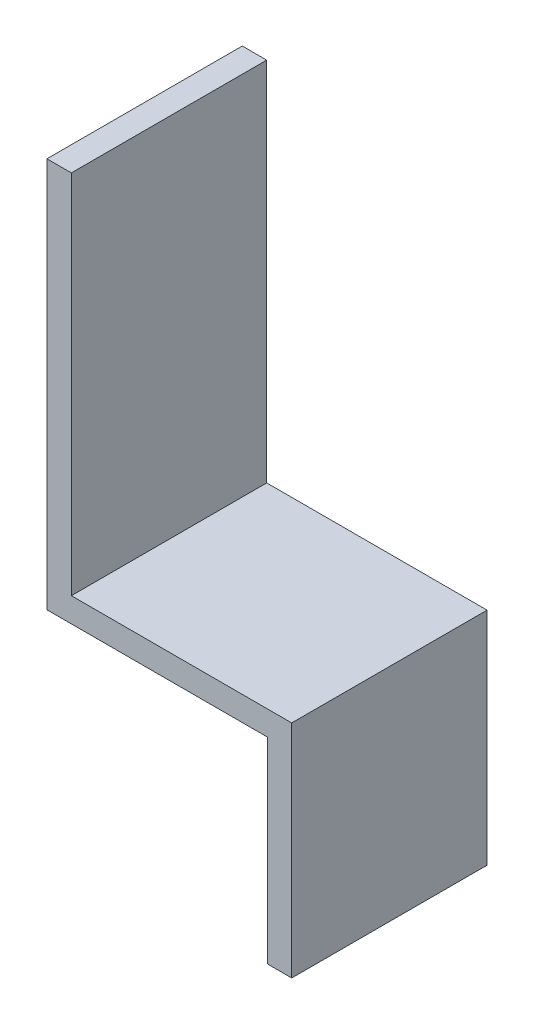
ISO-10303-21;
HEADER;
FILE_DESCRIPTION(('STEP AP214'),'2;1');
FILE_NAME('part.step','',(''),(''),'','','');
FILE_SCHEMA(('AUTOMOTIVE_DESIGN { 1 0 10303 214 1 1 1 1 }'));
ENDSEC;
DATA;
#1=APPLICATION_CONTEXT('core data for automotive mechanical design processes');
#2=APPLICATION_PROTOCOL_DEFINITION('international standard','automotive_design',2000,#1);
#3=PRODUCT_CONTEXT('',#1,'mechanical');
#4=PRODUCT('Part','Part','',(#3));
#5=PRODUCT_RELATED_PRODUCT_CATEGORY('part','',(#4));
#6=PRODUCT_DEFINITION_FORMATION('','',#4);
#7=PRODUCT_DEFINITION_CONTEXT('part definition',#1,'design');
#8=PRODUCT_DEFINITION('design','',#6,#7);
#9=PRODUCT_DEFINITION_SHAPE('','',#8);
#10=(LENGTH_UNIT() NAMED_UNIT(*) SI_UNIT(.MILLI.,.METRE.));
#11=(NAMED_UNIT(*) PLANE_ANGLE_UNIT() SI_UNIT($,.RADIAN.));
#12=(NAMED_UNIT(*) SI_UNIT($,.STERADIAN.) SOLID_ANGLE_UNIT());
#13=UNCERTAINTY_MEASURE_WITH_UNIT(LENGTH_MEASURE(1.E-05),#10,'distance_accuracy_value','');
#14=(GEOMETRIC_REPRESENTATION_CONTEXT(3) GLOBAL_UNCERTAINTY_ASSIGNED_CONTEXT((#13)) GLOBAL_UNIT_ASSIGNED_CONTEXT((#10,
#11,#12)) REPRESENTATION_CONTEXT('',''));
#15=CARTESIAN_POINT('',(0.,0.,0.));
#16=DIRECTION('',(0.,0.,1.));
#17=DIRECTION('',(1.,0.,0.));
#18=AXIS2_PLACEMENT_3D('',#15,#16,#17);
#19=CARTESIAN_POINT('',(39.283846791473,-34.3837534396166,25.4));
#20=DIRECTION('',(0.,1.,0.));
#21=DIRECTION('',(-1.,0.,0.));
#22=AXIS2_PLACEMENT_3D('',#19,#20,#21);
#23=PLANE('',#22);
#24=DIRECTION('',(1.,0.,0.));
#25=VECTOR('',#24,1.);
#26=CARTESIAN_POINT('',(39.283846791473,-34.3837534396166,0.));
#27=LINE('',#26,#25);
#28=CARTESIAN_POINT('',(36.108846791473,-34.3837534396167,0.));
#29=VERTEX_POINT('',#28);
#30=CARTESIAN_POINT('',(39.283846791473,-34.3837534396166,0.));
#31=VERTEX_POINT('',#30);
#32=EDGE_CURVE('E140',#29,#31,#27,.T.);
#33=ORIENTED_EDGE('',*,*,#32,.T.);
#34=DIRECTION('',(0.,0.,-1.));
#35=VECTOR('',#34,1.);
#36=CARTESIAN_POINT('',(39.283846791473,-34.3837534396166,25.4));
#37=LINE('',#36,#35);
#38=CARTESIAN_POINT('',(39.283846791473,-34.3837534396166,25.4));
#39=VERTEX_POINT('',#38);
#40=EDGE_CURVE('E11',#39,#31,#37,.T.);
#41=ORIENTED_EDGE('',*,*,#40,.F.);
#42=DIRECTION('',(1.,0.,0.));
#43=VECTOR('',#42,1.);
#44=CARTESIAN_POINT('',(39.283846791473,-34.3837534396166,25.4));
#45=LINE('',#44,#43);
#46=CARTESIAN_POINT('',(36.108846791473,-34.3837534396167,25.4));
#47=VERTEX_POINT('',#46);
#48=EDGE_CURVE('E162',#47,#39,#45,.T.);
#49=ORIENTED_EDGE('',*,*,#48,.F.);
#50=DIRECTION('',(0.,0.,-1.));
#51=VECTOR('',#50,1.);
#52=CARTESIAN_POINT('',(36.108846791473,-34.3837534396167,25.4));
#53=LINE('',#52,#51);
#54=EDGE_CURVE('E136',#47,#29,#53,.T.);
#55=ORIENTED_EDGE('',*,*,#54,.T.);
#56=EDGE_LOOP('',(#33,#41,#49,#55));
#57=FACE_BOUND('',#56,.T.);
#58=ADVANCED_FACE('F39',(#57),#23,.F.);
#59=CARTESIAN_POINT('',(39.283846791473,-34.3837534396166,25.4));
#60=DIRECTION('',(-1.,0.,0.));
#61=DIRECTION('',(0.,0.,1.));
#62=AXIS2_PLACEMENT_3D('',#59,#60,#61);
#63=PLANE('',#62);
#64=DIRECTION('',(0.,1.,0.));
#65=VECTOR('',#64,1.);
#66=CARTESIAN_POINT('',(39.283846791473,-34.3837534396166,0.));
#67=LINE('',#66,#65);
#68=CARTESIAN_POINT('',(39.283846791473,-5.6598685159866,0.));
#69=VERTEX_POINT('',#68);
#70=EDGE_CURVE('E144',#31,#69,#67,.T.);
#71=ORIENTED_EDGE('',*,*,#70,.T.);
#72=DIRECTION('',(0.,0.,-1.));
#73=VECTOR('',#72,1.);
#74=CARTESIAN_POINT('',(39.283846791473,-5.6598685159866,25.4));
#75=LINE('',#74,#73);
#76=CARTESIAN_POINT('',(39.283846791473,-5.6598685159866,25.4));
#77=VERTEX_POINT('',#76);
#78=EDGE_CURVE('E48',#77,#69,#75,.T.);
#79=ORIENTED_EDGE('',*,*,#78,.F.);
#80=DIRECTION('',(0.,1.,0.));
#81=VECTOR('',#80,1.);
#82=CARTESIAN_POINT('',(39.283846791473,-34.3837534396166,25.4));
#83=LINE('',#82,#81);
#84=EDGE_CURVE('E99',#39,#77,#83,.T.);
#85=ORIENTED_EDGE('',*,*,#84,.F.);
#86=ORIENTED_EDGE('',*,*,#40,.T.);
#87=EDGE_LOOP('',(#71,#79,#85,#86));
#88=FACE_BOUND('',#87,.T.);
#89=ADVANCED_FACE('F208',(#88),#63,.F.);
#90=CARTESIAN_POINT('',(39.283846791473,-5.6598685159866,25.4));
#91=DIRECTION('',(0.,-1.,0.));
#92=DIRECTION('',(0.,0.,-1.));
#93=AXIS2_PLACEMENT_3D('',#90,#91,#92);
#94=PLANE('',#93);
#95=DIRECTION('',(-1.,0.,0.));
#96=VECTOR('',#95,1.);
#97=CARTESIAN_POINT('',(39.283846791473,-5.6598685159866,0.));
#98=LINE('',#97,#96);
#99=CARTESIAN_POINT('',(10.6321772247651,-5.6598685159866,0.));
#100=VERTEX_POINT('',#99);
#101=EDGE_CURVE('E147',#69,#100,#98,.T.);
#102=ORIENTED_EDGE('',*,*,#101,.T.);
#103=DIRECTION('',(0.,0.,-1.));
#104=VECTOR('',#103,1.);
#105=CARTESIAN_POINT('',(10.6321772247651,-5.6598685159866,25.4));
#106=LINE('',#105,#104);
#107=CARTESIAN_POINT('',(10.6321772247651,-5.6598685159866,25.4));
#108=VERTEX_POINT('',#107);
#109=EDGE_CURVE('E173',#108,#100,#106,.T.);
#110=ORIENTED_EDGE('',*,*,#109,.F.);
#111=DIRECTION('',(-1.,0.,0.));
#112=VECTOR('',#111,1.);
#113=CARTESIAN_POINT('',(39.283846791473,-5.6598685159866,25.4));
#114=LINE('',#113,#112);
#115=EDGE_CURVE('E183',#77,#108,#114,.T.);
#116=ORIENTED_EDGE('',*,*,#115,.F.);
#117=ORIENTED_EDGE('',*,*,#78,.T.);
#118=EDGE_LOOP('',(#102,#110,#116,#117));
#119=FACE_BOUND('',#118,.T.);
#120=ADVANCED_FACE('F181',(#119),#94,.F.);
#121=CARTESIAN_POINT('',(10.6321772247651,-5.6598685159866,25.4));
#122=DIRECTION('',(-1.,0.,0.));
#123=DIRECTION('',(0.,0.,1.));
#124=AXIS2_PLACEMENT_3D('',#121,#122,#123);
#125=PLANE('',#124);
#126=DIRECTION('',(0.,1.,0.));
#127=VECTOR('',#126,1.);
#128=CARTESIAN_POINT('',(10.6321772247651,-5.6598685159866,0.));
#129=LINE('',#128,#127);
#130=CARTESIAN_POINT('',(10.6321772247651,41.9526124422462,0.));
#131=VERTEX_POINT('',#130);
#132=EDGE_CURVE('E150',#100,#131,#129,.T.);
#133=ORIENTED_EDGE('',*,*,#132,.T.);
#134=DIRECTION('',(0.,0.,-1.));
#135=VECTOR('',#134,1.);
#136=CARTESIAN_POINT('',(10.6321772247651,41.9526124422462,25.4));
#137=LINE('',#136,#135);
#138=CARTESIAN_POINT('',(10.6321772247651,41.9526124422462,25.4));
#139=VERTEX_POINT('',#138);
#140=EDGE_CURVE('E169',#139,#131,#137,.T.);
#141=ORIENTED_EDGE('',*,*,#140,.F.);
#142=DIRECTION('',(0.,1.,0.));
#143=VECTOR('',#142,1.);
#144=CARTESIAN_POINT('',(10.6321772247651,-5.6598685159866,25.4));
#145=LINE('',#144,#143);
#146=EDGE_CURVE('E196',#108,#139,#145,.T.);
#147=ORIENTED_EDGE('',*,*,#146,.F.);
#148=ORIENTED_EDGE('',*,*,#109,.T.);
#149=EDGE_LOOP('',(#133,#141,#147,#148));
#150=FACE_BOUND('',#149,.T.);
#151=ADVANCED_FACE('F191',(#150),#125,.F.);
#152=CARTESIAN_POINT('',(10.6321772247651,41.9526124422462,25.4));
#153=DIRECTION('',(0.,-1.,0.));
#154=DIRECTION('',(0.,0.,-1.));
#155=AXIS2_PLACEMENT_3D('',#152,#153,#154);
#156=PLANE('',#155);
#157=DIRECTION('',(-1.,0.,0.));
#158=VECTOR('',#157,1.);
#159=CARTESIAN_POINT('',(10.6321772247651,41.9526124422462,0.));
#160=LINE('',#159,#158);
#161=CARTESIAN_POINT('',(7.45717722476502,41.9526124422462,0.));
#162=VERTEX_POINT('',#161);
#163=EDGE_CURVE('E153',#131,#162,#160,.T.);
#164=ORIENTED_EDGE('',*,*,#163,.T.);
#165=DIRECTION('',(0.,0.,-1.));
#166=VECTOR('',#165,1.);
#167=CARTESIAN_POINT('',(7.45717722476502,41.9526124422462,25.4));
#168=LINE('',#167,#166);
#169=CARTESIAN_POINT('',(7.45717722476502,41.9526124422462,25.4));
#170=VERTEX_POINT('',#169);
#171=EDGE_CURVE('E129',#170,#162,#168,.T.);
#172=ORIENTED_EDGE('',*,*,#171,.F.);
#173=DIRECTION('',(-1.,0.,0.));
#174=VECTOR('',#173,1.);
#175=CARTESIAN_POINT('',(10.6321772247651,41.9526124422462,25.4));
#176=LINE('',#175,#174);
#177=EDGE_CURVE('E118',#139,#170,#176,.T.);
#178=ORIENTED_EDGE('',*,*,#177,.F.);
#179=ORIENTED_EDGE('',*,*,#140,.T.);
#180=EDGE_LOOP('',(#164,#172,#178,#179));
#181=FACE_BOUND('',#180,.T.);
#182=ADVANCED_FACE('F194',(#181),#156,.F.);
#183=CARTESIAN_POINT('',(7.45717722476502,-8.83486851598658,25.4));
#184=DIRECTION('',(1.,0.,0.));
#185=DIRECTION('',(0.,0.,-1.));
#186=AXIS2_PLACEMENT_3D('',#183,#184,#185);
#187=PLANE('',#186);
#188=DIRECTION('',(0.,-1.,0.));
#189=VECTOR('',#188,1.);
#190=CARTESIAN_POINT('',(7.45717722476502,-8.83486851598658,0.));
#191=LINE('',#190,#189);
#192=CARTESIAN_POINT('',(7.45717722476502,-8.83486851598658,0.));
#193=VERTEX_POINT('',#192);
#194=EDGE_CURVE('E127',#162,#193,#191,.T.);
#195=ORIENTED_EDGE('',*,*,#194,.T.);
#196=DIRECTION('',(0.,0.,-1.));
#197=VECTOR('',#196,1.);
#198=CARTESIAN_POINT('',(7.45717722476502,-8.83486851598658,25.4));
#199=LINE('',#198,#197);
#200=CARTESIAN_POINT('',(7.45717722476502,-8.83486851598658,25.4));
#201=VERTEX_POINT('',#200);
#202=EDGE_CURVE('E124',#201,#193,#199,.T.);
#203=ORIENTED_EDGE('',*,*,#202,.F.);
#204=DIRECTION('',(0.,-1.,0.));
#205=VECTOR('',#204,1.);
#206=CARTESIAN_POINT('',(7.45717722476502,-8.83486851598658,25.4));
#207=LINE('',#206,#205);
#208=EDGE_CURVE('E112',#170,#201,#207,.T.);
#209=ORIENTED_EDGE('',*,*,#208,.F.);
#210=ORIENTED_EDGE('',*,*,#171,.T.);
#211=EDGE_LOOP('',(#195,#203,#209,#210));
#212=FACE_BOUND('',#211,.T.);
#213=ADVANCED_FACE('F125',(#212),#187,.F.);
#214=CARTESIAN_POINT('',(36.108846791473,-8.83486851598658,25.4));
#215=DIRECTION('',(0.,1.,0.));
#216=DIRECTION('',(0.,0.,1.));
#217=AXIS2_PLACEMENT_3D('',#214,#215,#216);
#218=PLANE('',#217);
#219=DIRECTION('',(1.,0.,0.));
#220=VECTOR('',#219,1.);
#221=CARTESIAN_POINT('',(36.108846791473,-8.83486851598658,0.));
#222=LINE('',#221,#220);
#223=CARTESIAN_POINT('',(36.108846791473,-8.83486851598658,0.));
#224=VERTEX_POINT('',#223);
#225=EDGE_CURVE('E85',#193,#224,#222,.T.);
#226=ORIENTED_EDGE('',*,*,#225,.T.);
#227=DIRECTION('',(0.,0.,-1.));
#228=VECTOR('',#227,1.);
#229=CARTESIAN_POINT('',(36.108846791473,-8.83486851598658,25.4));
#230=LINE('',#229,#228);
#231=CARTESIAN_POINT('',(36.108846791473,-8.83486851598658,25.4));
#232=VERTEX_POINT('',#231);
#233=EDGE_CURVE('E130',#232,#224,#230,.T.);
#234=ORIENTED_EDGE('',*,*,#233,.F.);
#235=DIRECTION('',(1.,0.,0.));
#236=VECTOR('',#235,1.);
#237=CARTESIAN_POINT('',(36.108846791473,-8.83486851598658,25.4));
#238=LINE('',#237,#236);
#239=EDGE_CURVE('E116',#201,#232,#238,.T.);
#240=ORIENTED_EDGE('',*,*,#239,.F.);
#241=ORIENTED_EDGE('',*,*,#202,.T.);
#242=EDGE_LOOP('',(#226,#234,#240,#241));
#243=FACE_BOUND('',#242,.T.);
#244=ADVANCED_FACE('F132',(#243),#218,.F.);
#245=CARTESIAN_POINT('',(36.108846791473,-34.3837534396167,25.4));
#246=DIRECTION('',(1.,0.,0.));
#247=DIRECTION('',(0.,0.,-1.));
#248=AXIS2_PLACEMENT_3D('',#245,#246,#247);
#249=PLANE('',#248);
#250=DIRECTION('',(0.,-1.,0.));
#251=VECTOR('',#250,1.);
#252=CARTESIAN_POINT('',(36.108846791473,-34.3837534396167,0.));
#253=LINE('',#252,#251);
#254=EDGE_CURVE('E91',#224,#29,#253,.T.);
#255=ORIENTED_EDGE('',*,*,#254,.T.);
#256=ORIENTED_EDGE('',*,*,#54,.F.);
#257=DIRECTION('',(0.,-1.,0.));
#258=VECTOR('',#257,1.);
#259=CARTESIAN_POINT('',(36.108846791473,-34.3837534396167,25.4));
#260=LINE('',#259,#258);
#261=EDGE_CURVE('E56',#232,#47,#260,.T.);
#262=ORIENTED_EDGE('',*,*,#261,.F.);
#263=ORIENTED_EDGE('',*,*,#233,.T.);
#264=EDGE_LOOP('',(#255,#256,#262,#263));
#265=FACE_BOUND('',#264,.T.);
#266=ADVANCED_FACE('F224',(#265),#249,.F.);
#267=CARTESIAN_POINT('',(0.,0.,25.4));
#268=DIRECTION('',(0.,0.,-1.));
#269=DIRECTION('',(-1.,0.,0.));
#270=AXIS2_PLACEMENT_3D('',#267,#268,#269);
#271=PLANE('',#270);
#272=ORIENTED_EDGE('',*,*,#48,.T.);
#273=ORIENTED_EDGE('',*,*,#84,.T.);
#274=ORIENTED_EDGE('',*,*,#115,.T.);
#275=ORIENTED_EDGE('',*,*,#146,.T.);
#276=ORIENTED_EDGE('',*,*,#177,.T.);
#277=ORIENTED_EDGE('',*,*,#208,.T.);
#278=ORIENTED_EDGE('',*,*,#239,.T.);
#279=ORIENTED_EDGE('',*,*,#261,.T.);
#280=EDGE_LOOP('',(#272,#273,#274,#275,#276,#277,#278,#279));
#281=FACE_BOUND('',#280,.T.);
#282=ADVANCED_FACE('F114',(#281),#271,.F.);
#283=CARTESIAN_POINT('',(0.,0.,0.));
#284=DIRECTION('',(0.,0.,-1.));
#285=DIRECTION('',(-1.,0.,0.));
#286=AXIS2_PLACEMENT_3D('',#283,#284,#285);
#287=PLANE('',#286);
#288=ORIENTED_EDGE('',*,*,#32,.F.);
#289=ORIENTED_EDGE('',*,*,#254,.F.);
#290=ORIENTED_EDGE('',*,*,#225,.F.);
#291=ORIENTED_EDGE('',*,*,#194,.F.);
#292=ORIENTED_EDGE('',*,*,#163,.F.);
#293=ORIENTED_EDGE('',*,*,#132,.F.);
#294=ORIENTED_EDGE('',*,*,#101,.F.);
#295=ORIENTED_EDGE('',*,*,#70,.F.);
#296=EDGE_LOOP('',(#288,#289,#290,#291,#292,#293,#294,#295));
#297=FACE_BOUND('',#296,.T.);
#298=ADVANCED_FACE('F187',(#297),#287,.T.);
#299=CLOSED_SHELL('',(#58,#89,#120,#151,#182,#213,#244,#266,#282,#298));
#300=MANIFOLD_SOLID_BREP('B2',#299);
#301=ADVANCED_BREP_SHAPE_REPRESENTATION('',(#18,#300),#14);
#302=SHAPE_DEFINITION_REPRESENTATION(#9,#301);
ENDSEC;
END-ISO-10303-21;
